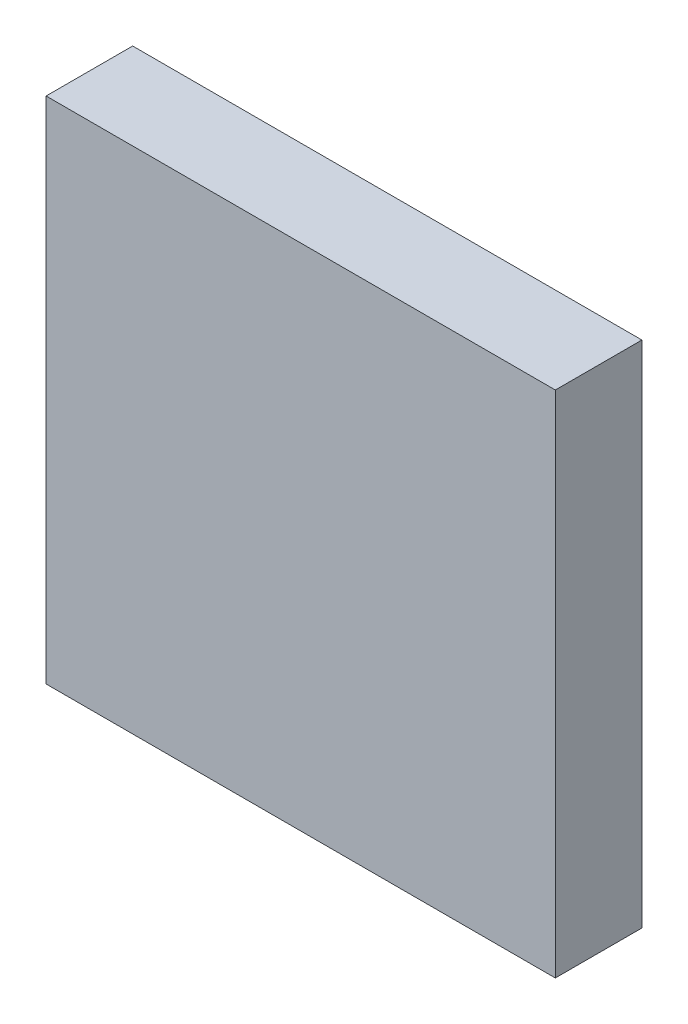
ISO-10303-21;
HEADER;
FILE_DESCRIPTION(('STEP AP214'),'2;1');
FILE_NAME('part.step','',(''),(''),'','','');
FILE_SCHEMA(('AUTOMOTIVE_DESIGN { 1 0 10303 214 1 1 1 1 }'));
ENDSEC;
DATA;
#1=APPLICATION_CONTEXT('core data for automotive mechanical design processes');
#2=APPLICATION_PROTOCOL_DEFINITION('international standard','automotive_design',2000,#1);
#3=PRODUCT_CONTEXT('',#1,'mechanical');
#4=PRODUCT('Part','Part','',(#3));
#5=PRODUCT_RELATED_PRODUCT_CATEGORY('part','',(#4));
#6=PRODUCT_DEFINITION_FORMATION('','',#4);
#7=PRODUCT_DEFINITION_CONTEXT('part definition',#1,'design');
#8=PRODUCT_DEFINITION('design','',#6,#7);
#9=PRODUCT_DEFINITION_SHAPE('','',#8);
#10=(LENGTH_UNIT() NAMED_UNIT(*) SI_UNIT(.MILLI.,.METRE.));
#11=(NAMED_UNIT(*) PLANE_ANGLE_UNIT() SI_UNIT($,.RADIAN.));
#12=(NAMED_UNIT(*) SI_UNIT($,.STERADIAN.) SOLID_ANGLE_UNIT());
#13=UNCERTAINTY_MEASURE_WITH_UNIT(LENGTH_MEASURE(1.E-05),#10,'distance_accuracy_value','');
#14=(GEOMETRIC_REPRESENTATION_CONTEXT(3) GLOBAL_UNCERTAINTY_ASSIGNED_CONTEXT((#13)) GLOBAL_UNIT_ASSIGNED_CONTEXT((#10,
#11,#12)) REPRESENTATION_CONTEXT('',''));
#15=CARTESIAN_POINT('',(0.,0.,0.));
#16=DIRECTION('',(0.,0.,1.));
#17=DIRECTION('',(1.,0.,0.));
#18=AXIS2_PLACEMENT_3D('',#15,#16,#17);
#19=CARTESIAN_POINT('',(0.,0.,15.3));
#20=DIRECTION('',(1.,0.,0.));
#21=DIRECTION('',(0.,0.,-1.));
#22=AXIS2_PLACEMENT_3D('',#19,#20,#21);
#23=PLANE('',#22);
#24=DIRECTION('',(0.,-1.,0.));
#25=VECTOR('',#24,1.);
#26=CARTESIAN_POINT('',(0.,0.,0.));
#27=LINE('',#26,#25);
#28=CARTESIAN_POINT('',(0.,90.,0.));
#29=VERTEX_POINT('',#28);
#30=CARTESIAN_POINT('',(0.,0.,0.));
#31=VERTEX_POINT('',#30);
#32=EDGE_CURVE('E97',#29,#31,#27,.T.);
#33=ORIENTED_EDGE('',*,*,#32,.T.);
#34=DIRECTION('',(0.,0.,-1.));
#35=VECTOR('',#34,1.);
#36=CARTESIAN_POINT('',(0.,0.,15.3));
#37=LINE('',#36,#35);
#38=CARTESIAN_POINT('',(0.,0.,15.3));
#39=VERTEX_POINT('',#38);
#40=EDGE_CURVE('E11',#39,#31,#37,.T.);
#41=ORIENTED_EDGE('',*,*,#40,.F.);
#42=DIRECTION('',(0.,-1.,0.));
#43=VECTOR('',#42,1.);
#44=CARTESIAN_POINT('',(0.,0.,15.3));
#45=LINE('',#44,#43);
#46=CARTESIAN_POINT('',(0.,90.,15.3));
#47=VERTEX_POINT('',#46);
#48=EDGE_CURVE('E85',#47,#39,#45,.T.);
#49=ORIENTED_EDGE('',*,*,#48,.F.);
#50=DIRECTION('',(0.,0.,-1.));
#51=VECTOR('',#50,1.);
#52=CARTESIAN_POINT('',(0.,90.,15.3));
#53=LINE('',#52,#51);
#54=EDGE_CURVE('E93',#47,#29,#53,.T.);
#55=ORIENTED_EDGE('',*,*,#54,.T.);
#56=EDGE_LOOP('',(#33,#41,#49,#55));
#57=FACE_BOUND('',#56,.T.);
#58=ADVANCED_FACE('F34',(#57),#23,.F.);
#59=CARTESIAN_POINT('',(0.,0.,15.3));
#60=DIRECTION('',(0.,1.,0.));
#61=DIRECTION('',(0.,0.,1.));
#62=AXIS2_PLACEMENT_3D('',#59,#60,#61);
#63=PLANE('',#62);
#64=DIRECTION('',(1.,0.,0.));
#65=VECTOR('',#64,1.);
#66=CARTESIAN_POINT('',(0.,0.,0.));
#67=LINE('',#66,#65);
#68=CARTESIAN_POINT('',(90.,0.,0.));
#69=VERTEX_POINT('',#68);
#70=EDGE_CURVE('E89',#31,#69,#67,.T.);
#71=ORIENTED_EDGE('',*,*,#70,.T.);
#72=DIRECTION('',(0.,0.,-1.));
#73=VECTOR('',#72,1.);
#74=CARTESIAN_POINT('',(90.,0.,15.3));
#75=LINE('',#74,#73);
#76=CARTESIAN_POINT('',(90.,0.,15.3));
#77=VERTEX_POINT('',#76);
#78=EDGE_CURVE('E42',#77,#69,#75,.T.);
#79=ORIENTED_EDGE('',*,*,#78,.F.);
#80=DIRECTION('',(1.,0.,0.));
#81=VECTOR('',#80,1.);
#82=CARTESIAN_POINT('',(0.,0.,15.3));
#83=LINE('',#82,#81);
#84=EDGE_CURVE('E80',#39,#77,#83,.T.);
#85=ORIENTED_EDGE('',*,*,#84,.F.);
#86=ORIENTED_EDGE('',*,*,#40,.T.);
#87=EDGE_LOOP('',(#71,#79,#85,#86));
#88=FACE_BOUND('',#87,.T.);
#89=ADVANCED_FACE('F88',(#88),#63,.F.);
#90=CARTESIAN_POINT('',(90.,0.,15.3));
#91=DIRECTION('',(-1.,0.,0.));
#92=DIRECTION('',(0.,0.,1.));
#93=AXIS2_PLACEMENT_3D('',#90,#91,#92);
#94=PLANE('',#93);
#95=DIRECTION('',(0.,1.,0.));
#96=VECTOR('',#95,1.);
#97=CARTESIAN_POINT('',(90.,0.,0.));
#98=LINE('',#97,#96);
#99=CARTESIAN_POINT('',(90.,90.,0.));
#100=VERTEX_POINT('',#99);
#101=EDGE_CURVE('E67',#69,#100,#98,.T.);
#102=ORIENTED_EDGE('',*,*,#101,.T.);
#103=DIRECTION('',(0.,0.,-1.));
#104=VECTOR('',#103,1.);
#105=CARTESIAN_POINT('',(90.,90.,15.3));
#106=LINE('',#105,#104);
#107=CARTESIAN_POINT('',(90.,90.,15.3));
#108=VERTEX_POINT('',#107);
#109=EDGE_CURVE('E90',#108,#100,#106,.T.);
#110=ORIENTED_EDGE('',*,*,#109,.F.);
#111=DIRECTION('',(0.,1.,0.));
#112=VECTOR('',#111,1.);
#113=CARTESIAN_POINT('',(90.,0.,15.3));
#114=LINE('',#113,#112);
#115=EDGE_CURVE('E83',#77,#108,#114,.T.);
#116=ORIENTED_EDGE('',*,*,#115,.F.);
#117=ORIENTED_EDGE('',*,*,#78,.T.);
#118=EDGE_LOOP('',(#102,#110,#116,#117));
#119=FACE_BOUND('',#118,.T.);
#120=ADVANCED_FACE('F91',(#119),#94,.F.);
#121=CARTESIAN_POINT('',(0.,90.,15.3));
#122=DIRECTION('',(0.,-1.,0.));
#123=DIRECTION('',(0.,0.,-1.));
#124=AXIS2_PLACEMENT_3D('',#121,#122,#123);
#125=PLANE('',#124);
#126=DIRECTION('',(-1.,0.,0.));
#127=VECTOR('',#126,1.);
#128=CARTESIAN_POINT('',(0.,90.,0.));
#129=LINE('',#128,#127);
#130=EDGE_CURVE('E73',#100,#29,#129,.T.);
#131=ORIENTED_EDGE('',*,*,#130,.T.);
#132=ORIENTED_EDGE('',*,*,#54,.F.);
#133=DIRECTION('',(-1.,0.,0.));
#134=VECTOR('',#133,1.);
#135=CARTESIAN_POINT('',(0.,90.,15.3));
#136=LINE('',#135,#134);
#137=EDGE_CURVE('E50',#108,#47,#136,.T.);
#138=ORIENTED_EDGE('',*,*,#137,.F.);
#139=ORIENTED_EDGE('',*,*,#109,.T.);
#140=EDGE_LOOP('',(#131,#132,#138,#139));
#141=FACE_BOUND('',#140,.T.);
#142=ADVANCED_FACE('F104',(#141),#125,.F.);
#143=CARTESIAN_POINT('',(0.,0.,15.3));
#144=DIRECTION('',(0.,0.,-1.));
#145=DIRECTION('',(-1.,0.,0.));
#146=AXIS2_PLACEMENT_3D('',#143,#144,#145);
#147=PLANE('',#146);
#148=ORIENTED_EDGE('',*,*,#48,.T.);
#149=ORIENTED_EDGE('',*,*,#84,.T.);
#150=ORIENTED_EDGE('',*,*,#115,.T.);
#151=ORIENTED_EDGE('',*,*,#137,.T.);
#152=EDGE_LOOP('',(#148,#149,#150,#151));
#153=FACE_BOUND('',#152,.T.);
#154=ADVANCED_FACE('F81',(#153),#147,.F.);
#155=CARTESIAN_POINT('',(0.,0.,0.));
#156=DIRECTION('',(0.,0.,-1.));
#157=DIRECTION('',(-1.,0.,0.));
#158=AXIS2_PLACEMENT_3D('',#155,#156,#157);
#159=PLANE('',#158);
#160=ORIENTED_EDGE('',*,*,#32,.F.);
#161=ORIENTED_EDGE('',*,*,#130,.F.);
#162=ORIENTED_EDGE('',*,*,#101,.F.);
#163=ORIENTED_EDGE('',*,*,#70,.F.);
#164=EDGE_LOOP('',(#160,#161,#162,#163));
#165=FACE_BOUND('',#164,.T.);
#166=ADVANCED_FACE('F107',(#165),#159,.T.);
#167=CLOSED_SHELL('',(#58,#89,#120,#142,#154,#166));
#168=MANIFOLD_SOLID_BREP('B2',#167);
#169=ADVANCED_BREP_SHAPE_REPRESENTATION('',(#18,#168),#14);
#170=SHAPE_DEFINITION_REPRESENTATION(#9,#169);
ENDSEC;
END-ISO-10303-21;
